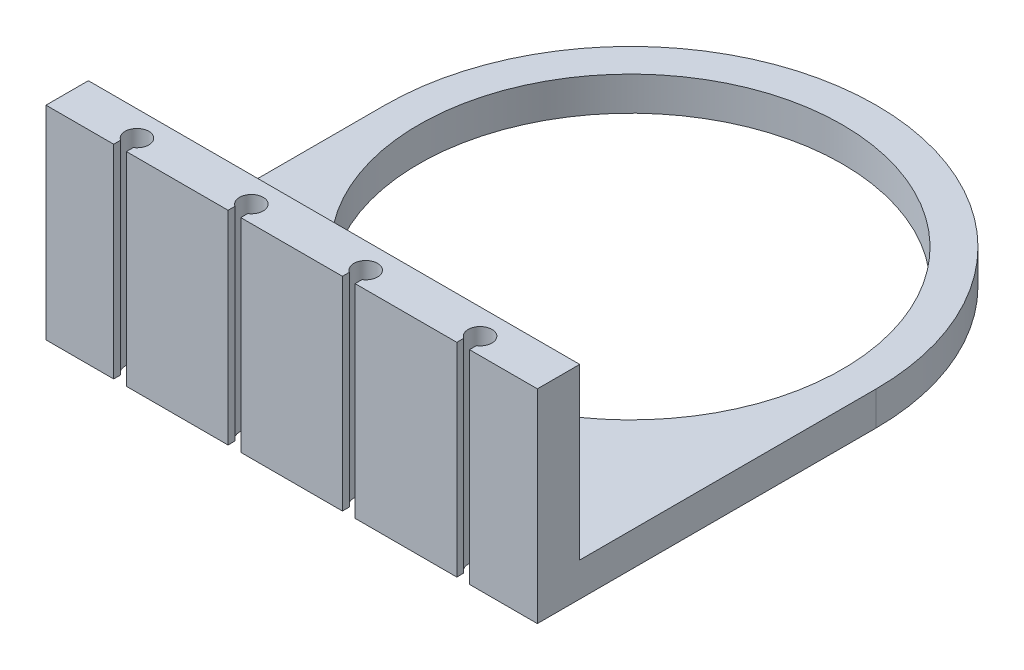
ISO-10303-21;
HEADER;
FILE_DESCRIPTION(('STEP AP214'),'2;1');
FILE_NAME('part.step','',(''),(''),'','','');
FILE_SCHEMA(('AUTOMOTIVE_DESIGN { 1 0 10303 214 1 1 1 1 }'));
ENDSEC;
DATA;
#1=APPLICATION_CONTEXT('core data for automotive mechanical design processes');
#2=APPLICATION_PROTOCOL_DEFINITION('international standard','automotive_design',2000,#1);
#3=PRODUCT_CONTEXT('',#1,'mechanical');
#4=PRODUCT('Part','Part','',(#3));
#5=PRODUCT_RELATED_PRODUCT_CATEGORY('part','',(#4));
#6=PRODUCT_DEFINITION_FORMATION('','',#4);
#7=PRODUCT_DEFINITION_CONTEXT('part definition',#1,'design');
#8=PRODUCT_DEFINITION('design','',#6,#7);
#9=PRODUCT_DEFINITION_SHAPE('','',#8);
#10=(LENGTH_UNIT() NAMED_UNIT(*) SI_UNIT(.MILLI.,.METRE.));
#11=(NAMED_UNIT(*) PLANE_ANGLE_UNIT() SI_UNIT($,.RADIAN.));
#12=(NAMED_UNIT(*) SI_UNIT($,.STERADIAN.) SOLID_ANGLE_UNIT());
#13=UNCERTAINTY_MEASURE_WITH_UNIT(LENGTH_MEASURE(1.E-05),#10,'distance_accuracy_value','');
#14=(GEOMETRIC_REPRESENTATION_CONTEXT(3) GLOBAL_UNCERTAINTY_ASSIGNED_CONTEXT((#13)) GLOBAL_UNIT_ASSIGNED_CONTEXT((#10,
#11,#12)) REPRESENTATION_CONTEXT('',''));
#15=CARTESIAN_POINT('',(0.,0.,0.));
#16=DIRECTION('',(0.,0.,1.));
#17=DIRECTION('',(1.,0.,0.));
#18=AXIS2_PLACEMENT_3D('',#15,#16,#17);
#19=CARTESIAN_POINT('',(0.,0.,100.));
#20=DIRECTION('',(0.,0.,-1.));
#21=DIRECTION('',(-1.,0.,0.));
#22=AXIS2_PLACEMENT_3D('',#19,#20,#21);
#23=PLANE('',#22);
#24=DIRECTION('',(1.,0.,0.));
#25=VECTOR('',#24,1.);
#26=CARTESIAN_POINT('',(-72.5,60.,100.));
#27=LINE('',#26,#25);
#28=CARTESIAN_POINT('',(-48.775,60.,100.));
#29=VERTEX_POINT('',#28);
#30=CARTESIAN_POINT('',(-18.775,60.,100.));
#31=VERTEX_POINT('',#30);
#32=EDGE_CURVE('E206',#29,#31,#27,.T.);
#33=ORIENTED_EDGE('',*,*,#32,.F.);
#34=DIRECTION('',(0.,-1.,0.));
#35=VECTOR('',#34,1.);
#36=CARTESIAN_POINT('',(-48.775,0.,100.));
#37=LINE('',#36,#35);
#38=CARTESIAN_POINT('',(-48.775,0.,100.));
#39=VERTEX_POINT('',#38);
#40=EDGE_CURVE('E187',#29,#39,#37,.T.);
#41=ORIENTED_EDGE('',*,*,#40,.T.);
#42=DIRECTION('',(1.,0.,0.));
#43=VECTOR('',#42,1.);
#44=CARTESIAN_POINT('',(-72.5,0.,100.));
#45=LINE('',#44,#43);
#46=CARTESIAN_POINT('',(-18.775,0.,100.));
#47=VERTEX_POINT('',#46);
#48=EDGE_CURVE('E274',#39,#47,#45,.T.);
#49=ORIENTED_EDGE('',*,*,#48,.T.);
#50=DIRECTION('',(0.,1.,0.));
#51=VECTOR('',#50,1.);
#52=CARTESIAN_POINT('',(-18.775,0.,100.));
#53=LINE('',#52,#51);
#54=EDGE_CURVE('E215',#47,#31,#53,.T.);
#55=ORIENTED_EDGE('',*,*,#54,.T.);
#56=EDGE_LOOP('',(#33,#41,#49,#55));
#57=FACE_BOUND('',#56,.T.);
#58=ADVANCED_FACE('F39',(#57),#23,.F.);
#59=CARTESIAN_POINT('',(-15.025,60.,100.));
#60=VERTEX_POINT('',#59);
#61=CARTESIAN_POINT('',(14.975,60.,100.));
#62=VERTEX_POINT('',#61);
#63=EDGE_CURVE('E218',#60,#62,#27,.T.);
#64=ORIENTED_EDGE('',*,*,#63,.F.);
#65=DIRECTION('',(0.,-1.,0.));
#66=VECTOR('',#65,1.);
#67=CARTESIAN_POINT('',(-15.025,0.,100.));
#68=LINE('',#67,#66);
#69=CARTESIAN_POINT('',(-15.025,0.,100.));
#70=VERTEX_POINT('',#69);
#71=EDGE_CURVE('E404',#60,#70,#68,.T.);
#72=ORIENTED_EDGE('',*,*,#71,.T.);
#73=CARTESIAN_POINT('',(14.975,0.,100.));
#74=VERTEX_POINT('',#73);
#75=EDGE_CURVE('E451',#70,#74,#45,.T.);
#76=ORIENTED_EDGE('',*,*,#75,.T.);
#77=DIRECTION('',(0.,1.,0.));
#78=VECTOR('',#77,1.);
#79=CARTESIAN_POINT('',(14.975,0.,100.));
#80=LINE('',#79,#78);
#81=EDGE_CURVE('E412',#74,#62,#80,.T.);
#82=ORIENTED_EDGE('',*,*,#81,.T.);
#83=EDGE_LOOP('',(#64,#72,#76,#82));
#84=FACE_BOUND('',#83,.T.);
#85=ADVANCED_FACE('F494',(#84),#23,.F.);
#86=CARTESIAN_POINT('',(18.725,60.,100.));
#87=VERTEX_POINT('',#86);
#88=CARTESIAN_POINT('',(48.725,60.,100.));
#89=VERTEX_POINT('',#88);
#90=EDGE_CURVE('E226',#87,#89,#27,.T.);
#91=ORIENTED_EDGE('',*,*,#90,.F.);
#92=DIRECTION('',(0.,-1.,0.));
#93=VECTOR('',#92,1.);
#94=CARTESIAN_POINT('',(18.725,0.,100.));
#95=LINE('',#94,#93);
#96=CARTESIAN_POINT('',(18.725,0.,100.));
#97=VERTEX_POINT('',#96);
#98=EDGE_CURVE('E420',#87,#97,#95,.T.);
#99=ORIENTED_EDGE('',*,*,#98,.T.);
#100=CARTESIAN_POINT('',(48.725,0.,100.));
#101=VERTEX_POINT('',#100);
#102=EDGE_CURVE('E449',#97,#101,#45,.T.);
#103=ORIENTED_EDGE('',*,*,#102,.T.);
#104=DIRECTION('',(0.,1.,0.));
#105=VECTOR('',#104,1.);
#106=CARTESIAN_POINT('',(48.725,0.,100.));
#107=LINE('',#106,#105);
#108=EDGE_CURVE('E426',#101,#89,#107,.T.);
#109=ORIENTED_EDGE('',*,*,#108,.T.);
#110=EDGE_LOOP('',(#91,#99,#103,#109));
#111=FACE_BOUND('',#110,.T.);
#112=ADVANCED_FACE('F448',(#111),#23,.F.);
#113=CARTESIAN_POINT('',(52.475,60.,100.));
#114=VERTEX_POINT('',#113);
#115=CARTESIAN_POINT('',(72.5,60.,100.));
#116=VERTEX_POINT('',#115);
#117=EDGE_CURVE('E224',#114,#116,#27,.T.);
#118=ORIENTED_EDGE('',*,*,#117,.F.);
#119=DIRECTION('',(0.,-1.,0.));
#120=VECTOR('',#119,1.);
#121=CARTESIAN_POINT('',(52.475,0.,100.));
#122=LINE('',#121,#120);
#123=CARTESIAN_POINT('',(52.475,0.,100.));
#124=VERTEX_POINT('',#123);
#125=EDGE_CURVE('E432',#114,#124,#122,.T.);
#126=ORIENTED_EDGE('',*,*,#125,.T.);
#127=CARTESIAN_POINT('',(72.5,0.,100.));
#128=VERTEX_POINT('',#127);
#129=EDGE_CURVE('E268',#124,#128,#45,.T.);
#130=ORIENTED_EDGE('',*,*,#129,.T.);
#131=DIRECTION('',(0.,1.,0.));
#132=VECTOR('',#131,1.);
#133=CARTESIAN_POINT('',(72.5,0.,100.));
#134=LINE('',#133,#132);
#135=EDGE_CURVE('E250',#128,#116,#134,.T.);
#136=ORIENTED_EDGE('',*,*,#135,.T.);
#137=EDGE_LOOP('',(#118,#126,#130,#136));
#138=FACE_BOUND('',#137,.T.);
#139=ADVANCED_FACE('F457',(#138),#23,.F.);
#140=CARTESIAN_POINT('',(0.,10.,0.));
#141=DIRECTION('',(0.,-1.,0.));
#142=DIRECTION('',(0.,0.,-1.));
#143=AXIS2_PLACEMENT_3D('',#140,#141,#142);
#144=CYLINDRICAL_SURFACE('',#143,72.5);
#145=DIRECTION('',(0.,1.,0.));
#146=VECTOR('',#145,1.);
#147=CARTESIAN_POINT('',(72.5,0.,0.));
#148=LINE('',#147,#146);
#149=CARTESIAN_POINT('',(72.5,0.,0.));
#150=VERTEX_POINT('',#149);
#151=CARTESIAN_POINT('',(72.5,10.,0.));
#152=VERTEX_POINT('',#151);
#153=EDGE_CURVE('E249',#150,#152,#148,.T.);
#154=ORIENTED_EDGE('',*,*,#153,.F.);
#155=CARTESIAN_POINT('',(0.,0.,0.));
#156=DIRECTION('',(0.,1.,0.));
#157=DIRECTION('',(0.,0.,1.));
#158=AXIS2_PLACEMENT_3D('',#155,#156,#157);
#159=CIRCLE('',#158,72.5);
#160=CARTESIAN_POINT('',(-72.5,0.,0.));
#161=VERTEX_POINT('',#160);
#162=EDGE_CURVE('E288',#150,#161,#159,.T.);
#163=ORIENTED_EDGE('',*,*,#162,.T.);
#164=DIRECTION('',(0.,-1.,0.));
#165=VECTOR('',#164,1.);
#166=CARTESIAN_POINT('',(-72.5,0.,0.));
#167=LINE('',#166,#165);
#168=CARTESIAN_POINT('',(-72.5,10.,0.));
#169=VERTEX_POINT('',#168);
#170=EDGE_CURVE('E263',#169,#161,#167,.T.);
#171=ORIENTED_EDGE('',*,*,#170,.F.);
#172=CARTESIAN_POINT('',(0.,10.,0.));
#173=DIRECTION('',(0.,1.,0.));
#174=DIRECTION('',(0.,0.,1.));
#175=AXIS2_PLACEMENT_3D('',#172,#173,#174);
#176=CIRCLE('',#175,72.5);
#177=EDGE_CURVE('E292',#152,#169,#176,.T.);
#178=ORIENTED_EDGE('',*,*,#177,.F.);
#179=EDGE_LOOP('',(#154,#163,#171,#178));
#180=FACE_BOUND('',#179,.T.);
#181=ADVANCED_FACE('F41',(#180),#144,.T.);
#182=CARTESIAN_POINT('',(0.,10.,0.));
#183=DIRECTION('',(0.,-1.,0.));
#184=DIRECTION('',(0.,0.,-1.));
#185=AXIS2_PLACEMENT_3D('',#182,#183,#184);
#186=CYLINDRICAL_SURFACE('',#185,62.5);
#187=CARTESIAN_POINT('',(0.,10.,0.));
#188=DIRECTION('',(0.,1.,0.));
#189=DIRECTION('',(0.,0.,1.));
#190=AXIS2_PLACEMENT_3D('',#187,#188,#189);
#191=CIRCLE('',#190,62.5);
#192=CARTESIAN_POINT('',(0.,10.,62.5));
#193=VERTEX_POINT('',#192);
#194=EDGE_CURVE('E284',#193,#193,#191,.T.);
#195=ORIENTED_EDGE('',*,*,#194,.T.);
#196=EDGE_LOOP('',(#195));
#197=FACE_BOUND('',#196,.T.);
#198=CARTESIAN_POINT('',(0.,0.,0.));
#199=DIRECTION('',(0.,1.,0.));
#200=DIRECTION('',(0.,0.,1.));
#201=AXIS2_PLACEMENT_3D('',#198,#199,#200);
#202=CIRCLE('',#201,62.5);
#203=CARTESIAN_POINT('',(0.,0.,62.5));
#204=VERTEX_POINT('',#203);
#205=EDGE_CURVE('E283',#204,#204,#202,.T.);
#206=ORIENTED_EDGE('',*,*,#205,.F.);
#207=EDGE_LOOP('',(#206));
#208=FACE_BOUND('',#207,.T.);
#209=ADVANCED_FACE('F511',(#197,#208),#186,.F.);
#210=CARTESIAN_POINT('',(0.,10.,0.));
#211=DIRECTION('',(0.,1.,0.));
#212=DIRECTION('',(0.,0.,1.));
#213=AXIS2_PLACEMENT_3D('',#210,#211,#212);
#214=PLANE('',#213);
#215=DIRECTION('',(-1.,0.,0.));
#216=VECTOR('',#215,1.);
#217=CARTESIAN_POINT('',(-72.5,10.,87.5));
#218=LINE('',#217,#216);
#219=CARTESIAN_POINT('',(72.5,10.,87.5));
#220=VERTEX_POINT('',#219);
#221=CARTESIAN_POINT('',(-72.5,10.,87.5));
#222=VERTEX_POINT('',#221);
#223=EDGE_CURVE('E237',#220,#222,#218,.T.);
#224=ORIENTED_EDGE('',*,*,#223,.F.);
#225=DIRECTION('',(0.,0.,-1.));
#226=VECTOR('',#225,1.);
#227=CARTESIAN_POINT('',(72.5,10.,100.));
#228=LINE('',#227,#226);
#229=EDGE_CURVE('E260',#220,#152,#228,.T.);
#230=ORIENTED_EDGE('',*,*,#229,.T.);
#231=ORIENTED_EDGE('',*,*,#177,.T.);
#232=DIRECTION('',(0.,0.,-1.));
#233=VECTOR('',#232,1.);
#234=CARTESIAN_POINT('',(-72.5,10.,100.));
#235=LINE('',#234,#233);
#236=EDGE_CURVE('E273',#222,#169,#235,.T.);
#237=ORIENTED_EDGE('',*,*,#236,.F.);
#238=EDGE_LOOP('',(#224,#230,#231,#237));
#239=FACE_BOUND('',#238,.T.);
#240=ORIENTED_EDGE('',*,*,#194,.F.);
#241=EDGE_LOOP('',(#240));
#242=FACE_BOUND('',#241,.T.);
#243=ADVANCED_FACE('F481',(#239,#242),#214,.T.);
#244=CARTESIAN_POINT('',(0.,0.,0.));
#245=DIRECTION('',(0.,1.,0.));
#246=DIRECTION('',(0.,0.,1.));
#247=AXIS2_PLACEMENT_3D('',#244,#245,#246);
#248=PLANE('',#247);
#249=ORIENTED_EDGE('',*,*,#48,.F.);
#250=DIRECTION('',(0.,0.,-1.));
#251=VECTOR('',#250,1.);
#252=CARTESIAN_POINT('',(-48.775,0.,0.));
#253=LINE('',#252,#251);
#254=CARTESIAN_POINT('',(-48.775,0.,97.9553976043842));
#255=VERTEX_POINT('',#254);
#256=EDGE_CURVE('E193',#39,#255,#253,.T.);
#257=ORIENTED_EDGE('',*,*,#256,.T.);
#258=CARTESIAN_POINT('',(-50.65,0.,95.));
#259=DIRECTION('',(0.,1.,0.));
#260=DIRECTION('',(0.,0.,1.));
#261=AXIS2_PLACEMENT_3D('',#258,#259,#260);
#262=CIRCLE('',#261,3.50000000000001);
#263=CARTESIAN_POINT('',(-52.525,0.,97.9553976043842));
#264=VERTEX_POINT('',#263);
#265=EDGE_CURVE('E241',#255,#264,#262,.T.);
#266=ORIENTED_EDGE('',*,*,#265,.T.);
#267=DIRECTION('',(0.,0.,1.));
#268=VECTOR('',#267,1.);
#269=CARTESIAN_POINT('',(-52.525,0.,0.));
#270=LINE('',#269,#268);
#271=CARTESIAN_POINT('',(-52.525,0.,100.));
#272=VERTEX_POINT('',#271);
#273=EDGE_CURVE('E358',#264,#272,#270,.T.);
#274=ORIENTED_EDGE('',*,*,#273,.T.);
#275=CARTESIAN_POINT('',(-72.5,0.,100.));
#276=VERTEX_POINT('',#275);
#277=EDGE_CURVE('E269',#276,#272,#45,.T.);
#278=ORIENTED_EDGE('',*,*,#277,.F.);
#279=DIRECTION('',(0.,0.,-1.));
#280=VECTOR('',#279,1.);
#281=CARTESIAN_POINT('',(-72.5,0.,100.));
#282=LINE('',#281,#280);
#283=EDGE_CURVE('E280',#276,#161,#282,.T.);
#284=ORIENTED_EDGE('',*,*,#283,.T.);
#285=ORIENTED_EDGE('',*,*,#162,.F.);
#286=DIRECTION('',(0.,0.,-1.));
#287=VECTOR('',#286,1.);
#288=CARTESIAN_POINT('',(72.5,0.,100.));
#289=LINE('',#288,#287);
#290=EDGE_CURVE('E254',#128,#150,#289,.T.);
#291=ORIENTED_EDGE('',*,*,#290,.F.);
#292=ORIENTED_EDGE('',*,*,#129,.F.);
#293=DIRECTION('',(0.,0.,-1.));
#294=VECTOR('',#293,1.);
#295=CARTESIAN_POINT('',(52.475,0.,0.));
#296=LINE('',#295,#294);
#297=CARTESIAN_POINT('',(52.475,0.,97.9553976043842));
#298=VERTEX_POINT('',#297);
#299=EDGE_CURVE('E338',#124,#298,#296,.T.);
#300=ORIENTED_EDGE('',*,*,#299,.T.);
#301=CARTESIAN_POINT('',(50.6,0.,95.));
#302=DIRECTION('',(0.,1.,0.));
#303=DIRECTION('',(0.,0.,1.));
#304=AXIS2_PLACEMENT_3D('',#301,#302,#303);
#305=CIRCLE('',#304,3.50000000000001);
#306=CARTESIAN_POINT('',(48.725,0.,97.9553976043842));
#307=VERTEX_POINT('',#306);
#308=EDGE_CURVE('E327',#298,#307,#305,.T.);
#309=ORIENTED_EDGE('',*,*,#308,.T.);
#310=DIRECTION('',(0.,0.,1.));
#311=VECTOR('',#310,1.);
#312=CARTESIAN_POINT('',(48.725,0.,0.));
#313=LINE('',#312,#311);
#314=EDGE_CURVE('E55',#307,#101,#313,.T.);
#315=ORIENTED_EDGE('',*,*,#314,.T.);
#316=ORIENTED_EDGE('',*,*,#102,.F.);
#317=DIRECTION('',(0.,0.,-1.));
#318=VECTOR('',#317,1.);
#319=CARTESIAN_POINT('',(18.725,0.,0.));
#320=LINE('',#319,#318);
#321=CARTESIAN_POINT('',(18.725,0.,97.9553976043842));
#322=VERTEX_POINT('',#321);
#323=EDGE_CURVE('E416',#97,#322,#320,.T.);
#324=ORIENTED_EDGE('',*,*,#323,.T.);
#325=CARTESIAN_POINT('',(16.85,0.,95.));
#326=DIRECTION('',(0.,1.,0.));
#327=DIRECTION('',(0.,0.,1.));
#328=AXIS2_PLACEMENT_3D('',#325,#326,#327);
#329=CIRCLE('',#328,3.50000000000001);
#330=CARTESIAN_POINT('',(14.975,0.,97.9553976043842));
#331=VERTEX_POINT('',#330);
#332=EDGE_CURVE('E340',#322,#331,#329,.T.);
#333=ORIENTED_EDGE('',*,*,#332,.T.);
#334=DIRECTION('',(0.,0.,1.));
#335=VECTOR('',#334,1.);
#336=CARTESIAN_POINT('',(14.975,0.,0.));
#337=LINE('',#336,#335);
#338=EDGE_CURVE('E408',#331,#74,#337,.T.);
#339=ORIENTED_EDGE('',*,*,#338,.T.);
#340=ORIENTED_EDGE('',*,*,#75,.F.);
#341=DIRECTION('',(0.,0.,-1.));
#342=VECTOR('',#341,1.);
#343=CARTESIAN_POINT('',(-15.025,0.,0.));
#344=LINE('',#343,#342);
#345=CARTESIAN_POINT('',(-15.025,0.,97.9553976043842));
#346=VERTEX_POINT('',#345);
#347=EDGE_CURVE('E400',#70,#346,#344,.T.);
#348=ORIENTED_EDGE('',*,*,#347,.T.);
#349=CARTESIAN_POINT('',(-16.9,0.,95.));
#350=DIRECTION('',(0.,1.,0.));
#351=DIRECTION('',(0.,0.,1.));
#352=AXIS2_PLACEMENT_3D('',#349,#350,#351);
#353=CIRCLE('',#352,3.50000000000001);
#354=CARTESIAN_POINT('',(-18.775,0.,97.9553976043842));
#355=VERTEX_POINT('',#354);
#356=EDGE_CURVE('E345',#346,#355,#353,.T.);
#357=ORIENTED_EDGE('',*,*,#356,.T.);
#358=DIRECTION('',(0.,0.,1.));
#359=VECTOR('',#358,1.);
#360=CARTESIAN_POINT('',(-18.775,0.,0.));
#361=LINE('',#360,#359);
#362=EDGE_CURVE('E199',#355,#47,#361,.T.);
#363=ORIENTED_EDGE('',*,*,#362,.T.);
#364=EDGE_LOOP('',(#249,#257,#266,#274,#278,#284,#285,#291,#292,#300,#309,#315,#316,#324,#333,
#339,#340,#348,#357,#363));
#365=FACE_BOUND('',#364,.T.);
#366=ORIENTED_EDGE('',*,*,#205,.T.);
#367=EDGE_LOOP('',(#366));
#368=FACE_BOUND('',#367,.T.);
#369=ADVANCED_FACE('F333',(#365,#368),#248,.F.);
#370=CARTESIAN_POINT('',(-72.5,0.,100.));
#371=DIRECTION('',(1.,0.,0.));
#372=DIRECTION('',(0.,0.,-1.));
#373=AXIS2_PLACEMENT_3D('',#370,#371,#372);
#374=PLANE('',#373);
#375=ORIENTED_EDGE('',*,*,#170,.T.);
#376=ORIENTED_EDGE('',*,*,#283,.F.);
#377=DIRECTION('',(0.,-1.,0.));
#378=VECTOR('',#377,1.);
#379=CARTESIAN_POINT('',(-72.5,0.,100.));
#380=LINE('',#379,#378);
#381=CARTESIAN_POINT('',(-72.5,60.,100.));
#382=VERTEX_POINT('',#381);
#383=EDGE_CURVE('E264',#382,#276,#380,.T.);
#384=ORIENTED_EDGE('',*,*,#383,.F.);
#385=DIRECTION('',(0.,0.,1.));
#386=VECTOR('',#385,1.);
#387=CARTESIAN_POINT('',(-72.5,60.,100.));
#388=LINE('',#387,#386);
#389=CARTESIAN_POINT('',(-72.5,60.,87.5));
#390=VERTEX_POINT('',#389);
#391=EDGE_CURVE('E229',#390,#382,#388,.T.);
#392=ORIENTED_EDGE('',*,*,#391,.F.);
#393=DIRECTION('',(0.,-1.,0.));
#394=VECTOR('',#393,1.);
#395=CARTESIAN_POINT('',(-72.5,60.,87.5));
#396=LINE('',#395,#394);
#397=EDGE_CURVE('E236',#390,#222,#396,.T.);
#398=ORIENTED_EDGE('',*,*,#397,.T.);
#399=ORIENTED_EDGE('',*,*,#236,.T.);
#400=EDGE_LOOP('',(#375,#376,#384,#392,#398,#399));
#401=FACE_BOUND('',#400,.T.);
#402=ADVANCED_FACE('F473',(#401),#374,.F.);
#403=ORIENTED_EDGE('',*,*,#277,.T.);
#404=DIRECTION('',(0.,1.,0.));
#405=VECTOR('',#404,1.);
#406=CARTESIAN_POINT('',(-52.525,0.,100.));
#407=LINE('',#406,#405);
#408=CARTESIAN_POINT('',(-52.525,60.,100.));
#409=VERTEX_POINT('',#408);
#410=EDGE_CURVE('E369',#272,#409,#407,.T.);
#411=ORIENTED_EDGE('',*,*,#410,.T.);
#412=EDGE_CURVE('E217',#382,#409,#27,.T.);
#413=ORIENTED_EDGE('',*,*,#412,.F.);
#414=ORIENTED_EDGE('',*,*,#383,.T.);
#415=EDGE_LOOP('',(#403,#411,#413,#414));
#416=FACE_BOUND('',#415,.T.);
#417=ADVANCED_FACE('F476',(#416),#23,.F.);
#418=CARTESIAN_POINT('',(72.5,0.,100.));
#419=DIRECTION('',(-1.,0.,0.));
#420=DIRECTION('',(0.,0.,1.));
#421=AXIS2_PLACEMENT_3D('',#418,#419,#420);
#422=PLANE('',#421);
#423=ORIENTED_EDGE('',*,*,#153,.T.);
#424=ORIENTED_EDGE('',*,*,#229,.F.);
#425=DIRECTION('',(0.,-1.,0.));
#426=VECTOR('',#425,1.);
#427=CARTESIAN_POINT('',(72.5,60.,87.5));
#428=LINE('',#427,#426);
#429=CARTESIAN_POINT('',(72.5,60.,87.5));
#430=VERTEX_POINT('',#429);
#431=EDGE_CURVE('E245',#430,#220,#428,.T.);
#432=ORIENTED_EDGE('',*,*,#431,.F.);
#433=DIRECTION('',(0.,0.,-1.));
#434=VECTOR('',#433,1.);
#435=CARTESIAN_POINT('',(72.5,60.,100.));
#436=LINE('',#435,#434);
#437=EDGE_CURVE('E223',#116,#430,#436,.T.);
#438=ORIENTED_EDGE('',*,*,#437,.F.);
#439=ORIENTED_EDGE('',*,*,#135,.F.);
#440=ORIENTED_EDGE('',*,*,#290,.T.);
#441=EDGE_LOOP('',(#423,#424,#432,#438,#439,#440));
#442=FACE_BOUND('',#441,.T.);
#443=ADVANCED_FACE('F463',(#442),#422,.F.);
#444=CARTESIAN_POINT('',(-72.5,60.,87.5));
#445=DIRECTION('',(0.,0.,1.));
#446=DIRECTION('',(1.,0.,0.));
#447=AXIS2_PLACEMENT_3D('',#444,#445,#446);
#448=PLANE('',#447);
#449=ORIENTED_EDGE('',*,*,#223,.T.);
#450=ORIENTED_EDGE('',*,*,#397,.F.);
#451=DIRECTION('',(-1.,0.,0.));
#452=VECTOR('',#451,1.);
#453=CARTESIAN_POINT('',(-72.5,60.,87.5));
#454=LINE('',#453,#452);
#455=EDGE_CURVE('E233',#430,#390,#454,.T.);
#456=ORIENTED_EDGE('',*,*,#455,.F.);
#457=ORIENTED_EDGE('',*,*,#431,.T.);
#458=EDGE_LOOP('',(#449,#450,#456,#457));
#459=FACE_BOUND('',#458,.T.);
#460=ADVANCED_FACE('F484',(#459),#448,.F.);
#461=CARTESIAN_POINT('',(0.,60.,0.));
#462=DIRECTION('',(0.,-1.,0.));
#463=DIRECTION('',(0.,0.,-1.));
#464=AXIS2_PLACEMENT_3D('',#461,#462,#463);
#465=PLANE('',#464);
#466=CARTESIAN_POINT('',(-50.65,60.,95.));
#467=DIRECTION('',(0.,-1.,0.));
#468=DIRECTION('',(0.,0.,-1.));
#469=AXIS2_PLACEMENT_3D('',#466,#467,#468);
#470=CIRCLE('',#469,3.50000000000001);
#471=CARTESIAN_POINT('',(-52.525,60.,97.9553976043842));
#472=VERTEX_POINT('',#471);
#473=CARTESIAN_POINT('',(-48.775,60.,97.9553976043842));
#474=VERTEX_POINT('',#473);
#475=EDGE_CURVE('E209',#472,#474,#470,.T.);
#476=ORIENTED_EDGE('',*,*,#475,.T.);
#477=DIRECTION('',(0.,0.,1.));
#478=VECTOR('',#477,1.);
#479=CARTESIAN_POINT('',(-48.775,60.,97.5));
#480=LINE('',#479,#478);
#481=EDGE_CURVE('E190',#474,#29,#480,.T.);
#482=ORIENTED_EDGE('',*,*,#481,.T.);
#483=ORIENTED_EDGE('',*,*,#32,.T.);
#484=DIRECTION('',(0.,0.,-1.));
#485=VECTOR('',#484,1.);
#486=CARTESIAN_POINT('',(-18.775,60.,97.5));
#487=LINE('',#486,#485);
#488=CARTESIAN_POINT('',(-18.775,60.,97.9553976043842));
#489=VERTEX_POINT('',#488);
#490=EDGE_CURVE('E372',#31,#489,#487,.T.);
#491=ORIENTED_EDGE('',*,*,#490,.T.);
#492=CARTESIAN_POINT('',(-16.9,60.,95.));
#493=DIRECTION('',(0.,-1.,0.));
#494=DIRECTION('',(0.,0.,-1.));
#495=AXIS2_PLACEMENT_3D('',#492,#493,#494);
#496=CIRCLE('',#495,3.50000000000001);
#497=CARTESIAN_POINT('',(-15.025,60.,97.9553976043842));
#498=VERTEX_POINT('',#497);
#499=EDGE_CURVE('E347',#489,#498,#496,.T.);
#500=ORIENTED_EDGE('',*,*,#499,.T.);
#501=DIRECTION('',(0.,0.,1.));
#502=VECTOR('',#501,1.);
#503=CARTESIAN_POINT('',(-15.025,60.,97.5));
#504=LINE('',#503,#502);
#505=EDGE_CURVE('E212',#498,#60,#504,.T.);
#506=ORIENTED_EDGE('',*,*,#505,.T.);
#507=ORIENTED_EDGE('',*,*,#63,.T.);
#508=DIRECTION('',(0.,0.,-1.));
#509=VECTOR('',#508,1.);
#510=CARTESIAN_POINT('',(14.975,60.,97.5));
#511=LINE('',#510,#509);
#512=CARTESIAN_POINT('',(14.975,60.,97.9553976043842));
#513=VERTEX_POINT('',#512);
#514=EDGE_CURVE('E379',#62,#513,#511,.T.);
#515=ORIENTED_EDGE('',*,*,#514,.T.);
#516=CARTESIAN_POINT('',(16.85,60.,95.));
#517=DIRECTION('',(0.,-1.,0.));
#518=DIRECTION('',(0.,0.,-1.));
#519=AXIS2_PLACEMENT_3D('',#516,#517,#518);
#520=CIRCLE('',#519,3.50000000000001);
#521=CARTESIAN_POINT('',(18.725,60.,97.9553976043842));
#522=VERTEX_POINT('',#521);
#523=EDGE_CURVE('E438',#513,#522,#520,.T.);
#524=ORIENTED_EDGE('',*,*,#523,.T.);
#525=DIRECTION('',(0.,0.,1.));
#526=VECTOR('',#525,1.);
#527=CARTESIAN_POINT('',(18.725,60.,97.5));
#528=LINE('',#527,#526);
#529=EDGE_CURVE('E375',#522,#87,#528,.T.);
#530=ORIENTED_EDGE('',*,*,#529,.T.);
#531=ORIENTED_EDGE('',*,*,#90,.T.);
#532=DIRECTION('',(0.,0.,-1.));
#533=VECTOR('',#532,1.);
#534=CARTESIAN_POINT('',(48.725,60.,97.5));
#535=LINE('',#534,#533);
#536=CARTESIAN_POINT('',(48.725,60.,97.9553976043842));
#537=VERTEX_POINT('',#536);
#538=EDGE_CURVE('E386',#89,#537,#535,.T.);
#539=ORIENTED_EDGE('',*,*,#538,.T.);
#540=CARTESIAN_POINT('',(50.6,60.,95.));
#541=DIRECTION('',(0.,-1.,0.));
#542=DIRECTION('',(0.,0.,-1.));
#543=AXIS2_PLACEMENT_3D('',#540,#541,#542);
#544=CIRCLE('',#543,3.50000000000001);
#545=CARTESIAN_POINT('',(52.475,60.,97.9553976043842));
#546=VERTEX_POINT('',#545);
#547=EDGE_CURVE('E329',#537,#546,#544,.T.);
#548=ORIENTED_EDGE('',*,*,#547,.T.);
#549=DIRECTION('',(0.,0.,1.));
#550=VECTOR('',#549,1.);
#551=CARTESIAN_POINT('',(52.475,60.,97.5));
#552=LINE('',#551,#550);
#553=EDGE_CURVE('E63',#546,#114,#552,.T.);
#554=ORIENTED_EDGE('',*,*,#553,.T.);
#555=ORIENTED_EDGE('',*,*,#117,.T.);
#556=ORIENTED_EDGE('',*,*,#437,.T.);
#557=ORIENTED_EDGE('',*,*,#455,.T.);
#558=ORIENTED_EDGE('',*,*,#391,.T.);
#559=ORIENTED_EDGE('',*,*,#412,.T.);
#560=DIRECTION('',(0.,0.,-1.));
#561=VECTOR('',#560,1.);
#562=CARTESIAN_POINT('',(-52.525,60.,97.5));
#563=LINE('',#562,#561);
#564=EDGE_CURVE('E211',#409,#472,#563,.T.);
#565=ORIENTED_EDGE('',*,*,#564,.T.);
#566=EDGE_LOOP('',(#476,#482,#483,#491,#500,#506,#507,#515,#524,#530,#531,#539,#548,#554,#555,
#556,#557,#558,#559,#565));
#567=FACE_BOUND('',#566,.T.);
#568=ADVANCED_FACE('F204',(#567),#465,.F.);
#569=CARTESIAN_POINT('',(50.6,60.,95.));
#570=DIRECTION('',(0.,-1.,0.));
#571=DIRECTION('',(0.,0.,-1.));
#572=AXIS2_PLACEMENT_3D('',#569,#570,#571);
#573=CYLINDRICAL_SURFACE('',#572,3.50000000000001);
#574=ORIENTED_EDGE('',*,*,#308,.F.);
#575=DIRECTION('',(0.,-1.,0.));
#576=VECTOR('',#575,1.);
#577=CARTESIAN_POINT('',(52.475,60.,97.9553976043842));
#578=LINE('',#577,#576);
#579=EDGE_CURVE('E11',#298,#546,#578,.F.);
#580=ORIENTED_EDGE('',*,*,#579,.T.);
#581=ORIENTED_EDGE('',*,*,#547,.F.);
#582=DIRECTION('',(0.,-1.,0.));
#583=VECTOR('',#582,1.);
#584=CARTESIAN_POINT('',(48.725,60.,97.9553976043842));
#585=LINE('',#584,#583);
#586=EDGE_CURVE('E48',#537,#307,#585,.T.);
#587=ORIENTED_EDGE('',*,*,#586,.T.);
#588=EDGE_LOOP('',(#574,#580,#581,#587));
#589=FACE_BOUND('',#588,.T.);
#590=ADVANCED_FACE('F326',(#589),#573,.F.);
#591=CARTESIAN_POINT('',(16.85,60.,95.));
#592=DIRECTION('',(0.,-1.,0.));
#593=DIRECTION('',(0.,0.,-1.));
#594=AXIS2_PLACEMENT_3D('',#591,#592,#593);
#595=CYLINDRICAL_SURFACE('',#594,3.50000000000001);
#596=ORIENTED_EDGE('',*,*,#332,.F.);
#597=DIRECTION('',(0.,-1.,0.));
#598=VECTOR('',#597,1.);
#599=CARTESIAN_POINT('',(18.725,60.,97.9553976043842));
#600=LINE('',#599,#598);
#601=EDGE_CURVE('E318',#322,#522,#600,.F.);
#602=ORIENTED_EDGE('',*,*,#601,.T.);
#603=ORIENTED_EDGE('',*,*,#523,.F.);
#604=DIRECTION('',(0.,-1.,0.));
#605=VECTOR('',#604,1.);
#606=CARTESIAN_POINT('',(14.975,60.,97.9553976043842));
#607=LINE('',#606,#605);
#608=EDGE_CURVE('E314',#513,#331,#607,.T.);
#609=ORIENTED_EDGE('',*,*,#608,.T.);
#610=EDGE_LOOP('',(#596,#602,#603,#609));
#611=FACE_BOUND('',#610,.T.);
#612=ADVANCED_FACE('F625',(#611),#595,.F.);
#613=CARTESIAN_POINT('',(-16.9,60.,95.));
#614=DIRECTION('',(0.,-1.,0.));
#615=DIRECTION('',(0.,0.,-1.));
#616=AXIS2_PLACEMENT_3D('',#613,#614,#615);
#617=CYLINDRICAL_SURFACE('',#616,3.50000000000001);
#618=ORIENTED_EDGE('',*,*,#356,.F.);
#619=DIRECTION('',(0.,-1.,0.));
#620=VECTOR('',#619,1.);
#621=CARTESIAN_POINT('',(-15.025,60.,97.9553976043842));
#622=LINE('',#621,#620);
#623=EDGE_CURVE('E310',#346,#498,#622,.F.);
#624=ORIENTED_EDGE('',*,*,#623,.T.);
#625=ORIENTED_EDGE('',*,*,#499,.F.);
#626=DIRECTION('',(0.,-1.,0.));
#627=VECTOR('',#626,1.);
#628=CARTESIAN_POINT('',(-18.775,60.,97.9553976043842));
#629=LINE('',#628,#627);
#630=EDGE_CURVE('E306',#489,#355,#629,.T.);
#631=ORIENTED_EDGE('',*,*,#630,.T.);
#632=EDGE_LOOP('',(#618,#624,#625,#631));
#633=FACE_BOUND('',#632,.T.);
#634=ADVANCED_FACE('F634',(#633),#617,.F.);
#635=CARTESIAN_POINT('',(-50.65,60.,95.));
#636=DIRECTION('',(0.,-1.,0.));
#637=DIRECTION('',(0.,0.,-1.));
#638=AXIS2_PLACEMENT_3D('',#635,#636,#637);
#639=CYLINDRICAL_SURFACE('',#638,3.50000000000001);
#640=ORIENTED_EDGE('',*,*,#265,.F.);
#641=DIRECTION('',(0.,-1.,0.));
#642=VECTOR('',#641,1.);
#643=CARTESIAN_POINT('',(-48.775,60.,97.9553976043842));
#644=LINE('',#643,#642);
#645=EDGE_CURVE('E303',#255,#474,#644,.F.);
#646=ORIENTED_EDGE('',*,*,#645,.T.);
#647=ORIENTED_EDGE('',*,*,#475,.F.);
#648=DIRECTION('',(0.,-1.,0.));
#649=VECTOR('',#648,1.);
#650=CARTESIAN_POINT('',(-52.525,60.,97.9553976043842));
#651=LINE('',#650,#649);
#652=EDGE_CURVE('E296',#472,#264,#651,.T.);
#653=ORIENTED_EDGE('',*,*,#652,.T.);
#654=EDGE_LOOP('',(#640,#646,#647,#653));
#655=FACE_BOUND('',#654,.T.);
#656=ADVANCED_FACE('F360',(#655),#639,.F.);
#657=CARTESIAN_POINT('',(-52.525,60.,97.5));
#658=DIRECTION('',(-1.,0.,0.));
#659=DIRECTION('',(0.,0.,1.));
#660=AXIS2_PLACEMENT_3D('',#657,#658,#659);
#661=PLANE('',#660);
#662=ORIENTED_EDGE('',*,*,#273,.F.);
#663=ORIENTED_EDGE('',*,*,#652,.F.);
#664=ORIENTED_EDGE('',*,*,#564,.F.);
#665=ORIENTED_EDGE('',*,*,#410,.F.);
#666=EDGE_LOOP('',(#662,#663,#664,#665));
#667=FACE_BOUND('',#666,.T.);
#668=ADVANCED_FACE('F362',(#667),#661,.F.);
#669=CARTESIAN_POINT('',(-48.775,60.,97.5));
#670=DIRECTION('',(1.,0.,0.));
#671=DIRECTION('',(0.,0.,-1.));
#672=AXIS2_PLACEMENT_3D('',#669,#670,#671);
#673=PLANE('',#672);
#674=ORIENTED_EDGE('',*,*,#481,.F.);
#675=ORIENTED_EDGE('',*,*,#645,.F.);
#676=ORIENTED_EDGE('',*,*,#256,.F.);
#677=ORIENTED_EDGE('',*,*,#40,.F.);
#678=EDGE_LOOP('',(#674,#675,#676,#677));
#679=FACE_BOUND('',#678,.T.);
#680=ADVANCED_FACE('F189',(#679),#673,.F.);
#681=CARTESIAN_POINT('',(-18.775,60.,97.5));
#682=DIRECTION('',(-1.,0.,0.));
#683=DIRECTION('',(0.,0.,1.));
#684=AXIS2_PLACEMENT_3D('',#681,#682,#683);
#685=PLANE('',#684);
#686=ORIENTED_EDGE('',*,*,#362,.F.);
#687=ORIENTED_EDGE('',*,*,#630,.F.);
#688=ORIENTED_EDGE('',*,*,#490,.F.);
#689=ORIENTED_EDGE('',*,*,#54,.F.);
#690=EDGE_LOOP('',(#686,#687,#688,#689));
#691=FACE_BOUND('',#690,.T.);
#692=ADVANCED_FACE('F669',(#691),#685,.F.);
#693=CARTESIAN_POINT('',(-15.025,60.,97.5));
#694=DIRECTION('',(1.,0.,0.));
#695=DIRECTION('',(0.,0.,-1.));
#696=AXIS2_PLACEMENT_3D('',#693,#694,#695);
#697=PLANE('',#696);
#698=ORIENTED_EDGE('',*,*,#505,.F.);
#699=ORIENTED_EDGE('',*,*,#623,.F.);
#700=ORIENTED_EDGE('',*,*,#347,.F.);
#701=ORIENTED_EDGE('',*,*,#71,.F.);
#702=EDGE_LOOP('',(#698,#699,#700,#701));
#703=FACE_BOUND('',#702,.T.);
#704=ADVANCED_FACE('F678',(#703),#697,.F.);
#705=CARTESIAN_POINT('',(14.975,60.,97.5));
#706=DIRECTION('',(-1.,0.,0.));
#707=DIRECTION('',(0.,0.,1.));
#708=AXIS2_PLACEMENT_3D('',#705,#706,#707);
#709=PLANE('',#708);
#710=ORIENTED_EDGE('',*,*,#338,.F.);
#711=ORIENTED_EDGE('',*,*,#608,.F.);
#712=ORIENTED_EDGE('',*,*,#514,.F.);
#713=ORIENTED_EDGE('',*,*,#81,.F.);
#714=EDGE_LOOP('',(#710,#711,#712,#713));
#715=FACE_BOUND('',#714,.T.);
#716=ADVANCED_FACE('F688',(#715),#709,.F.);
#717=CARTESIAN_POINT('',(18.725,60.,97.5));
#718=DIRECTION('',(1.,0.,0.));
#719=DIRECTION('',(0.,0.,-1.));
#720=AXIS2_PLACEMENT_3D('',#717,#718,#719);
#721=PLANE('',#720);
#722=ORIENTED_EDGE('',*,*,#529,.F.);
#723=ORIENTED_EDGE('',*,*,#601,.F.);
#724=ORIENTED_EDGE('',*,*,#323,.F.);
#725=ORIENTED_EDGE('',*,*,#98,.F.);
#726=EDGE_LOOP('',(#722,#723,#724,#725));
#727=FACE_BOUND('',#726,.T.);
#728=ADVANCED_FACE('F698',(#727),#721,.F.);
#729=CARTESIAN_POINT('',(48.725,60.,97.5));
#730=DIRECTION('',(-1.,0.,0.));
#731=DIRECTION('',(0.,0.,1.));
#732=AXIS2_PLACEMENT_3D('',#729,#730,#731);
#733=PLANE('',#732);
#734=ORIENTED_EDGE('',*,*,#314,.F.);
#735=ORIENTED_EDGE('',*,*,#586,.F.);
#736=ORIENTED_EDGE('',*,*,#538,.F.);
#737=ORIENTED_EDGE('',*,*,#108,.F.);
#738=EDGE_LOOP('',(#734,#735,#736,#737));
#739=FACE_BOUND('',#738,.T.);
#740=ADVANCED_FACE('F446',(#739),#733,.F.);
#741=CARTESIAN_POINT('',(52.475,60.,97.5));
#742=DIRECTION('',(1.,0.,0.));
#743=DIRECTION('',(0.,0.,-1.));
#744=AXIS2_PLACEMENT_3D('',#741,#742,#743);
#745=PLANE('',#744);
#746=ORIENTED_EDGE('',*,*,#553,.F.);
#747=ORIENTED_EDGE('',*,*,#579,.F.);
#748=ORIENTED_EDGE('',*,*,#299,.F.);
#749=ORIENTED_EDGE('',*,*,#125,.F.);
#750=EDGE_LOOP('',(#746,#747,#748,#749));
#751=FACE_BOUND('',#750,.T.);
#752=ADVANCED_FACE('F717',(#751),#745,.F.);
#753=CLOSED_SHELL('',(#58,#85,#112,#139,#181,#209,#243,#369,#402,#417,#443,#460,#568,#590,#612,
#634,#656,#668,#680,#692,#704,#716,#728,#740,#752));
#754=MANIFOLD_SOLID_BREP('B2',#753);
#755=ADVANCED_BREP_SHAPE_REPRESENTATION('',(#18,#754),#14);
#756=SHAPE_DEFINITION_REPRESENTATION(#9,#755);
ENDSEC;
END-ISO-10303-21;
